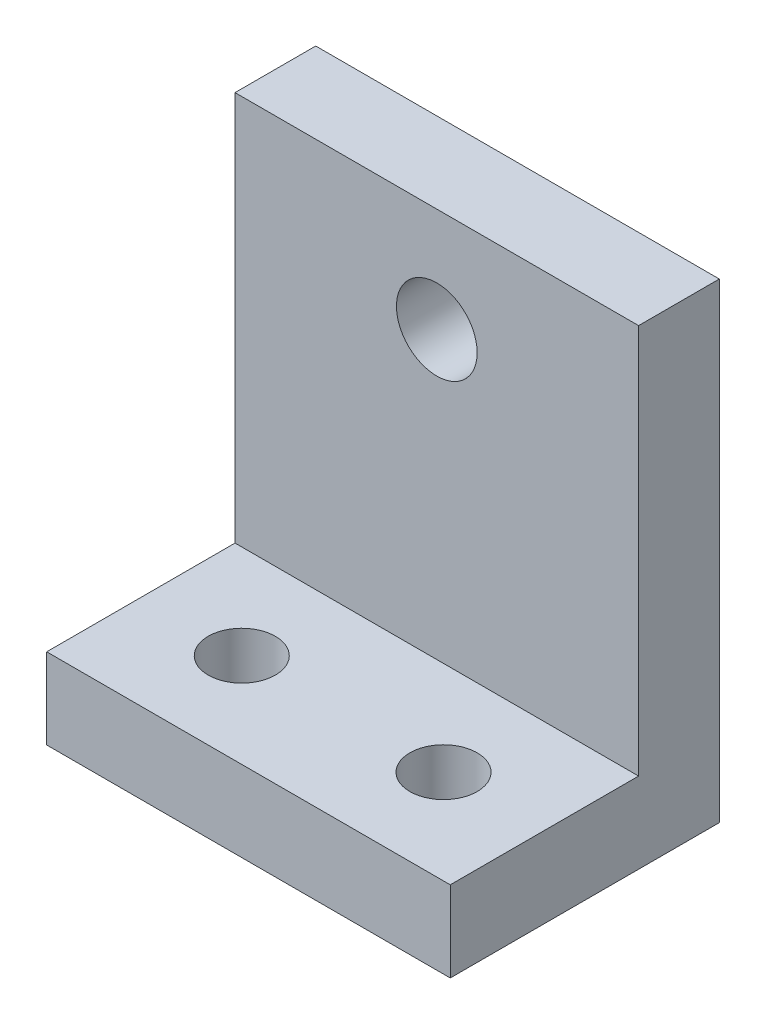
ISO-10303-21;
HEADER;
FILE_DESCRIPTION(('STEP AP214'),'2;1');
FILE_NAME('part.step','',(''),(''),'','','');
FILE_SCHEMA(('AUTOMOTIVE_DESIGN { 1 0 10303 214 1 1 1 1 }'));
ENDSEC;
DATA;
#1=APPLICATION_CONTEXT('core data for automotive mechanical design processes');
#2=APPLICATION_PROTOCOL_DEFINITION('international standard','automotive_design',2000,#1);
#3=PRODUCT_CONTEXT('',#1,'mechanical');
#4=PRODUCT('Part','Part','',(#3));
#5=PRODUCT_RELATED_PRODUCT_CATEGORY('part','',(#4));
#6=PRODUCT_DEFINITION_FORMATION('','',#4);
#7=PRODUCT_DEFINITION_CONTEXT('part definition',#1,'design');
#8=PRODUCT_DEFINITION('design','',#6,#7);
#9=PRODUCT_DEFINITION_SHAPE('','',#8);
#10=(LENGTH_UNIT() NAMED_UNIT(*) SI_UNIT(.MILLI.,.METRE.));
#11=(NAMED_UNIT(*) PLANE_ANGLE_UNIT() SI_UNIT($,.RADIAN.));
#12=(NAMED_UNIT(*) SI_UNIT($,.STERADIAN.) SOLID_ANGLE_UNIT());
#13=UNCERTAINTY_MEASURE_WITH_UNIT(LENGTH_MEASURE(1.E-05),#10,'distance_accuracy_value','');
#14=(GEOMETRIC_REPRESENTATION_CONTEXT(3) GLOBAL_UNCERTAINTY_ASSIGNED_CONTEXT((#13)) GLOBAL_UNIT_ASSIGNED_CONTEXT((#10,
#11,#12)) REPRESENTATION_CONTEXT('',''));
#15=CARTESIAN_POINT('',(0.,0.,0.));
#16=DIRECTION('',(0.,0.,1.));
#17=DIRECTION('',(1.,0.,0.));
#18=AXIS2_PLACEMENT_3D('',#15,#16,#17);
#19=CARTESIAN_POINT('',(15.,6.,10.));
#20=DIRECTION('',(-1.,0.,0.));
#21=DIRECTION('',(0.,0.,1.));
#22=AXIS2_PLACEMENT_3D('',#19,#20,#21);
#23=PLANE('',#22);
#24=DIRECTION('',(0.,0.,-1.));
#25=VECTOR('',#24,1.);
#26=CARTESIAN_POINT('',(15.,0.,10.));
#27=LINE('',#26,#25);
#28=CARTESIAN_POINT('',(15.,0.,10.));
#29=VERTEX_POINT('',#28);
#30=CARTESIAN_POINT('',(15.,0.,-10.));
#31=VERTEX_POINT('',#30);
#32=EDGE_CURVE('E127',#29,#31,#27,.T.);
#33=ORIENTED_EDGE('',*,*,#32,.T.);
#34=DIRECTION('',(0.,-1.,0.));
#35=VECTOR('',#34,1.);
#36=CARTESIAN_POINT('',(15.,6.,-10.));
#37=LINE('',#36,#35);
#38=CARTESIAN_POINT('',(15.,35.,-10.));
#39=VERTEX_POINT('',#38);
#40=EDGE_CURVE('E11',#39,#31,#37,.T.);
#41=ORIENTED_EDGE('',*,*,#40,.F.);
#42=DIRECTION('',(0.,0.,-1.));
#43=VECTOR('',#42,1.);
#44=CARTESIAN_POINT('',(15.,35.,-4.));
#45=LINE('',#44,#43);
#46=CARTESIAN_POINT('',(15.,35.,-4.));
#47=VERTEX_POINT('',#46);
#48=EDGE_CURVE('E111',#47,#39,#45,.T.);
#49=ORIENTED_EDGE('',*,*,#48,.F.);
#50=DIRECTION('',(0.,-1.,0.));
#51=VECTOR('',#50,1.);
#52=CARTESIAN_POINT('',(15.,0.,-4.));
#53=LINE('',#52,#51);
#54=CARTESIAN_POINT('',(15.,6.,-4.));
#55=VERTEX_POINT('',#54);
#56=EDGE_CURVE('E102',#47,#55,#53,.T.);
#57=ORIENTED_EDGE('',*,*,#56,.T.);
#58=DIRECTION('',(0.,0.,-1.));
#59=VECTOR('',#58,1.);
#60=CARTESIAN_POINT('',(15.,6.,10.));
#61=LINE('',#60,#59);
#62=CARTESIAN_POINT('',(15.,6.,10.));
#63=VERTEX_POINT('',#62);
#64=EDGE_CURVE('E59',#63,#55,#61,.T.);
#65=ORIENTED_EDGE('',*,*,#64,.F.);
#66=DIRECTION('',(0.,-1.,0.));
#67=VECTOR('',#66,1.);
#68=CARTESIAN_POINT('',(15.,6.,10.));
#69=LINE('',#68,#67);
#70=EDGE_CURVE('E136',#63,#29,#69,.T.);
#71=ORIENTED_EDGE('',*,*,#70,.T.);
#72=EDGE_LOOP('',(#33,#41,#49,#57,#65,#71));
#73=FACE_BOUND('',#72,.T.);
#74=ADVANCED_FACE('F39',(#73),#23,.F.);
#75=CARTESIAN_POINT('',(-15.,6.,-10.));
#76=DIRECTION('',(0.,0.,1.));
#77=DIRECTION('',(1.,0.,0.));
#78=AXIS2_PLACEMENT_3D('',#75,#76,#77);
#79=PLANE('',#78);
#80=CARTESIAN_POINT('',(0.,27.25,-10.));
#81=DIRECTION('',(0.,0.,1.));
#82=DIRECTION('',(1.,0.,0.));
#83=AXIS2_PLACEMENT_3D('',#80,#81,#82);
#84=CIRCLE('',#83,3.);
#85=CARTESIAN_POINT('',(3.,27.25,-10.));
#86=VERTEX_POINT('',#85);
#87=EDGE_CURVE('E122',#86,#86,#84,.T.);
#88=ORIENTED_EDGE('',*,*,#87,.T.);
#89=EDGE_LOOP('',(#88));
#90=FACE_BOUND('',#89,.T.);
#91=DIRECTION('',(-1.,0.,0.));
#92=VECTOR('',#91,1.);
#93=CARTESIAN_POINT('',(-15.,0.,-10.));
#94=LINE('',#93,#92);
#95=CARTESIAN_POINT('',(-15.,0.,-10.));
#96=VERTEX_POINT('',#95);
#97=EDGE_CURVE('E139',#31,#96,#94,.T.);
#98=ORIENTED_EDGE('',*,*,#97,.T.);
#99=DIRECTION('',(0.,-1.,0.));
#100=VECTOR('',#99,1.);
#101=CARTESIAN_POINT('',(-15.,6.,-10.));
#102=LINE('',#101,#100);
#103=CARTESIAN_POINT('',(-15.,35.,-10.));
#104=VERTEX_POINT('',#103);
#105=EDGE_CURVE('E47',#104,#96,#102,.T.);
#106=ORIENTED_EDGE('',*,*,#105,.F.);
#107=DIRECTION('',(1.,0.,0.));
#108=VECTOR('',#107,1.);
#109=CARTESIAN_POINT('',(15.,35.,-10.));
#110=LINE('',#109,#108);
#111=EDGE_CURVE('E109',#104,#39,#110,.T.);
#112=ORIENTED_EDGE('',*,*,#111,.T.);
#113=ORIENTED_EDGE('',*,*,#40,.T.);
#114=EDGE_LOOP('',(#98,#106,#112,#113));
#115=FACE_BOUND('',#114,.T.);
#116=ADVANCED_FACE('F218',(#90,#115),#79,.F.);
#117=CARTESIAN_POINT('',(-15.,6.,10.));
#118=DIRECTION('',(1.,0.,0.));
#119=DIRECTION('',(0.,0.,-1.));
#120=AXIS2_PLACEMENT_3D('',#117,#118,#119);
#121=PLANE('',#120);
#122=DIRECTION('',(0.,0.,1.));
#123=VECTOR('',#122,1.);
#124=CARTESIAN_POINT('',(-15.,6.,10.));
#125=LINE('',#124,#123);
#126=CARTESIAN_POINT('',(-15.,6.,-4.));
#127=VERTEX_POINT('',#126);
#128=CARTESIAN_POINT('',(-15.,6.,10.));
#129=VERTEX_POINT('',#128);
#130=EDGE_CURVE('E97',#127,#129,#125,.T.);
#131=ORIENTED_EDGE('',*,*,#130,.F.);
#132=DIRECTION('',(0.,1.,0.));
#133=VECTOR('',#132,1.);
#134=CARTESIAN_POINT('',(-15.,0.,-4.));
#135=LINE('',#134,#133);
#136=CARTESIAN_POINT('',(-15.,35.,-4.));
#137=VERTEX_POINT('',#136);
#138=EDGE_CURVE('E90',#127,#137,#135,.T.);
#139=ORIENTED_EDGE('',*,*,#138,.T.);
#140=DIRECTION('',(0.,0.,-1.));
#141=VECTOR('',#140,1.);
#142=CARTESIAN_POINT('',(-15.,35.,-4.));
#143=LINE('',#142,#141);
#144=EDGE_CURVE('E94',#137,#104,#143,.T.);
#145=ORIENTED_EDGE('',*,*,#144,.T.);
#146=ORIENTED_EDGE('',*,*,#105,.T.);
#147=DIRECTION('',(0.,0.,1.));
#148=VECTOR('',#147,1.);
#149=CARTESIAN_POINT('',(-15.,0.,10.));
#150=LINE('',#149,#148);
#151=CARTESIAN_POINT('',(-15.,0.,10.));
#152=VERTEX_POINT('',#151);
#153=EDGE_CURVE('E142',#96,#152,#150,.T.);
#154=ORIENTED_EDGE('',*,*,#153,.T.);
#155=DIRECTION('',(0.,-1.,0.));
#156=VECTOR('',#155,1.);
#157=CARTESIAN_POINT('',(-15.,6.,10.));
#158=LINE('',#157,#156);
#159=EDGE_CURVE('E150',#129,#152,#158,.T.);
#160=ORIENTED_EDGE('',*,*,#159,.F.);
#161=EDGE_LOOP('',(#131,#139,#145,#146,#154,#160));
#162=FACE_BOUND('',#161,.T.);
#163=ADVANCED_FACE('F92',(#162),#121,.F.);
#164=CARTESIAN_POINT('',(-15.,6.,10.));
#165=DIRECTION('',(0.,0.,-1.));
#166=DIRECTION('',(-1.,0.,0.));
#167=AXIS2_PLACEMENT_3D('',#164,#165,#166);
#168=PLANE('',#167);
#169=DIRECTION('',(1.,0.,0.));
#170=VECTOR('',#169,1.);
#171=CARTESIAN_POINT('',(-15.,0.,10.));
#172=LINE('',#171,#170);
#173=EDGE_CURVE('E130',#152,#29,#172,.T.);
#174=ORIENTED_EDGE('',*,*,#173,.T.);
#175=ORIENTED_EDGE('',*,*,#70,.F.);
#176=DIRECTION('',(1.,0.,0.));
#177=VECTOR('',#176,1.);
#178=CARTESIAN_POINT('',(-15.,6.,10.));
#179=LINE('',#178,#177);
#180=EDGE_CURVE('E133',#129,#63,#179,.T.);
#181=ORIENTED_EDGE('',*,*,#180,.F.);
#182=ORIENTED_EDGE('',*,*,#159,.T.);
#183=EDGE_LOOP('',(#174,#175,#181,#182));
#184=FACE_BOUND('',#183,.T.);
#185=ADVANCED_FACE('F163',(#184),#168,.F.);
#186=CARTESIAN_POINT('',(0.,6.,0.));
#187=DIRECTION('',(0.,-1.,0.));
#188=DIRECTION('',(0.,0.,-1.));
#189=AXIS2_PLACEMENT_3D('',#186,#187,#188);
#190=PLANE('',#189);
#191=CARTESIAN_POINT('',(-7.5,6.,3.));
#192=DIRECTION('',(0.,1.,0.));
#193=DIRECTION('',(0.,0.,1.));
#194=AXIS2_PLACEMENT_3D('',#191,#192,#193);
#195=CIRCLE('',#194,2.5);
#196=CARTESIAN_POINT('',(-7.5,6.,5.5));
#197=VERTEX_POINT('',#196);
#198=EDGE_CURVE('E184',#197,#197,#195,.T.);
#199=ORIENTED_EDGE('',*,*,#198,.F.);
#200=EDGE_LOOP('',(#199));
#201=FACE_BOUND('',#200,.T.);
#202=CARTESIAN_POINT('',(7.5,6.,3.));
#203=DIRECTION('',(0.,1.,0.));
#204=DIRECTION('',(0.,0.,1.));
#205=AXIS2_PLACEMENT_3D('',#202,#203,#204);
#206=CIRCLE('',#205,2.5);
#207=CARTESIAN_POINT('',(7.5,6.,5.5));
#208=VERTEX_POINT('',#207);
#209=EDGE_CURVE('E176',#208,#208,#206,.T.);
#210=ORIENTED_EDGE('',*,*,#209,.F.);
#211=EDGE_LOOP('',(#210));
#212=FACE_BOUND('',#211,.T.);
#213=ORIENTED_EDGE('',*,*,#64,.T.);
#214=DIRECTION('',(-1.,0.,0.));
#215=VECTOR('',#214,1.);
#216=CARTESIAN_POINT('',(0.,6.,-4.));
#217=LINE('',#216,#215);
#218=EDGE_CURVE('E54',#55,#127,#217,.T.);
#219=ORIENTED_EDGE('',*,*,#218,.T.);
#220=ORIENTED_EDGE('',*,*,#130,.T.);
#221=ORIENTED_EDGE('',*,*,#180,.T.);
#222=EDGE_LOOP('',(#213,#219,#220,#221));
#223=FACE_BOUND('',#222,.T.);
#224=ADVANCED_FACE('F201',(#201,#212,#223),#190,.F.);
#225=CARTESIAN_POINT('',(0.,0.,0.));
#226=DIRECTION('',(0.,-1.,0.));
#227=DIRECTION('',(0.,0.,-1.));
#228=AXIS2_PLACEMENT_3D('',#225,#226,#227);
#229=PLANE('',#228);
#230=CARTESIAN_POINT('',(-7.5,0.,3.));
#231=DIRECTION('',(0.,1.,0.));
#232=DIRECTION('',(0.,0.,1.));
#233=AXIS2_PLACEMENT_3D('',#230,#231,#232);
#234=CIRCLE('',#233,2.5);
#235=CARTESIAN_POINT('',(-7.5,0.,5.5));
#236=VERTEX_POINT('',#235);
#237=EDGE_CURVE('E172',#236,#236,#234,.T.);
#238=ORIENTED_EDGE('',*,*,#237,.T.);
#239=EDGE_LOOP('',(#238));
#240=FACE_BOUND('',#239,.T.);
#241=CARTESIAN_POINT('',(7.5,0.,3.));
#242=DIRECTION('',(0.,1.,0.));
#243=DIRECTION('',(0.,0.,1.));
#244=AXIS2_PLACEMENT_3D('',#241,#242,#243);
#245=CIRCLE('',#244,2.5);
#246=CARTESIAN_POINT('',(7.5,0.,5.5));
#247=VERTEX_POINT('',#246);
#248=EDGE_CURVE('E180',#247,#247,#245,.T.);
#249=ORIENTED_EDGE('',*,*,#248,.T.);
#250=EDGE_LOOP('',(#249));
#251=FACE_BOUND('',#250,.T.);
#252=ORIENTED_EDGE('',*,*,#173,.F.);
#253=ORIENTED_EDGE('',*,*,#153,.F.);
#254=ORIENTED_EDGE('',*,*,#97,.F.);
#255=ORIENTED_EDGE('',*,*,#32,.F.);
#256=EDGE_LOOP('',(#252,#253,#254,#255));
#257=FACE_BOUND('',#256,.T.);
#258=ADVANCED_FACE('F159',(#240,#251,#257),#229,.T.);
#259=CARTESIAN_POINT('',(0.,0.,-4.));
#260=DIRECTION('',(0.,0.,1.));
#261=DIRECTION('',(1.,0.,0.));
#262=AXIS2_PLACEMENT_3D('',#259,#260,#261);
#263=PLANE('',#262);
#264=CARTESIAN_POINT('',(0.,27.25,-4.));
#265=DIRECTION('',(0.,0.,1.));
#266=DIRECTION('',(1.,0.,0.));
#267=AXIS2_PLACEMENT_3D('',#264,#265,#266);
#268=CIRCLE('',#267,3.);
#269=CARTESIAN_POINT('',(3.,27.25,-4.));
#270=VERTEX_POINT('',#269);
#271=EDGE_CURVE('E168',#270,#270,#268,.T.);
#272=ORIENTED_EDGE('',*,*,#271,.F.);
#273=EDGE_LOOP('',(#272));
#274=FACE_BOUND('',#273,.T.);
#275=ORIENTED_EDGE('',*,*,#218,.F.);
#276=ORIENTED_EDGE('',*,*,#56,.F.);
#277=DIRECTION('',(1.,0.,0.));
#278=VECTOR('',#277,1.);
#279=CARTESIAN_POINT('',(15.,35.,-4.));
#280=LINE('',#279,#278);
#281=EDGE_CURVE('E101',#137,#47,#280,.T.);
#282=ORIENTED_EDGE('',*,*,#281,.F.);
#283=ORIENTED_EDGE('',*,*,#138,.F.);
#284=EDGE_LOOP('',(#275,#276,#282,#283));
#285=FACE_BOUND('',#284,.T.);
#286=ADVANCED_FACE('F114',(#274,#285),#263,.T.);
#287=CARTESIAN_POINT('',(15.,35.,-4.));
#288=DIRECTION('',(0.,1.,0.));
#289=DIRECTION('',(0.,0.,1.));
#290=AXIS2_PLACEMENT_3D('',#287,#288,#289);
#291=PLANE('',#290);
#292=ORIENTED_EDGE('',*,*,#111,.F.);
#293=ORIENTED_EDGE('',*,*,#144,.F.);
#294=ORIENTED_EDGE('',*,*,#281,.T.);
#295=ORIENTED_EDGE('',*,*,#48,.T.);
#296=EDGE_LOOP('',(#292,#293,#294,#295));
#297=FACE_BOUND('',#296,.T.);
#298=ADVANCED_FACE('F106',(#297),#291,.T.);
#299=CARTESIAN_POINT('',(0.,27.25,-10.));
#300=DIRECTION('',(0.,0.,1.));
#301=DIRECTION('',(1.,0.,0.));
#302=AXIS2_PLACEMENT_3D('',#299,#300,#301);
#303=CYLINDRICAL_SURFACE('',#302,3.);
#304=ORIENTED_EDGE('',*,*,#87,.F.);
#305=EDGE_LOOP('',(#304));
#306=FACE_BOUND('',#305,.T.);
#307=ORIENTED_EDGE('',*,*,#271,.T.);
#308=EDGE_LOOP('',(#307));
#309=FACE_BOUND('',#308,.T.);
#310=ADVANCED_FACE('F208',(#306,#309),#303,.F.);
#311=CARTESIAN_POINT('',(7.5,0.,3.));
#312=DIRECTION('',(0.,1.,0.));
#313=DIRECTION('',(0.,0.,1.));
#314=AXIS2_PLACEMENT_3D('',#311,#312,#313);
#315=CYLINDRICAL_SURFACE('',#314,2.5);
#316=ORIENTED_EDGE('',*,*,#248,.F.);
#317=EDGE_LOOP('',(#316));
#318=FACE_BOUND('',#317,.T.);
#319=ORIENTED_EDGE('',*,*,#209,.T.);
#320=EDGE_LOOP('',(#319));
#321=FACE_BOUND('',#320,.T.);
#322=ADVANCED_FACE('F197',(#318,#321),#315,.F.);
#323=CARTESIAN_POINT('',(-7.5,0.,3.));
#324=DIRECTION('',(0.,1.,0.));
#325=DIRECTION('',(0.,0.,1.));
#326=AXIS2_PLACEMENT_3D('',#323,#324,#325);
#327=CYLINDRICAL_SURFACE('',#326,2.5);
#328=ORIENTED_EDGE('',*,*,#237,.F.);
#329=EDGE_LOOP('',(#328));
#330=FACE_BOUND('',#329,.T.);
#331=ORIENTED_EDGE('',*,*,#198,.T.);
#332=EDGE_LOOP('',(#331));
#333=FACE_BOUND('',#332,.T.);
#334=ADVANCED_FACE('F194',(#330,#333),#327,.F.);
#335=CLOSED_SHELL('',(#74,#116,#163,#185,#224,#258,#286,#298,#310,#322,#334));
#336=MANIFOLD_SOLID_BREP('B2',#335);
#337=ADVANCED_BREP_SHAPE_REPRESENTATION('',(#18,#336),#14);
#338=SHAPE_DEFINITION_REPRESENTATION(#9,#337);
ENDSEC;
END-ISO-10303-21;
